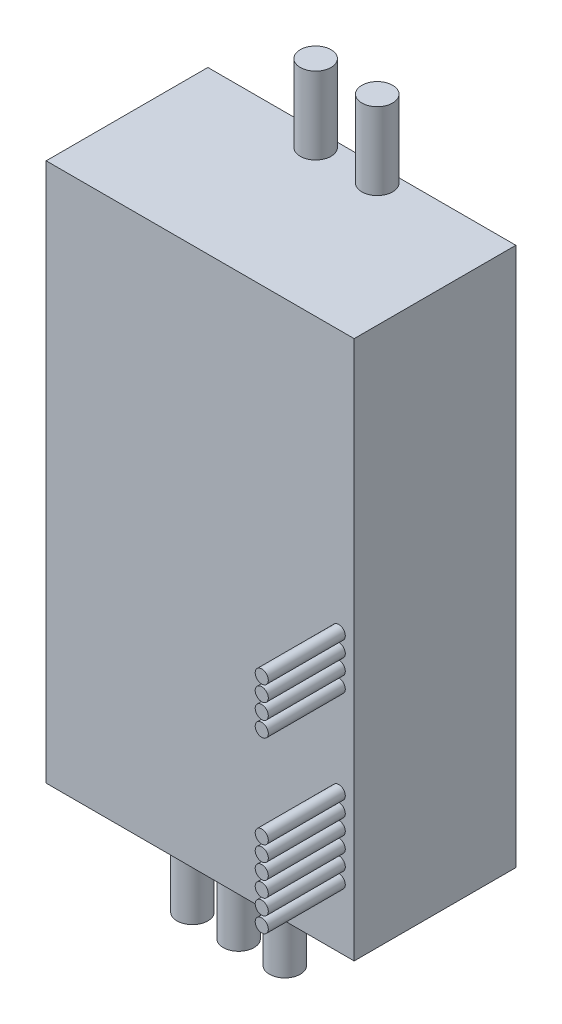
ISO-10303-21;
HEADER;
FILE_DESCRIPTION(('STEP AP214'),'2;1');
FILE_NAME('part.step','',(''),(''),'','','');
FILE_SCHEMA(('AUTOMOTIVE_DESIGN { 1 0 10303 214 1 1 1 1 }'));
ENDSEC;
DATA;
#1=APPLICATION_CONTEXT('core data for automotive mechanical design processes');
#2=APPLICATION_PROTOCOL_DEFINITION('international standard','automotive_design',2000,#1);
#3=PRODUCT_CONTEXT('',#1,'mechanical');
#4=PRODUCT('Part','Part','',(#3));
#5=PRODUCT_RELATED_PRODUCT_CATEGORY('part','',(#4));
#6=PRODUCT_DEFINITION_FORMATION('','',#4);
#7=PRODUCT_DEFINITION_CONTEXT('part definition',#1,'design');
#8=PRODUCT_DEFINITION('design','',#6,#7);
#9=PRODUCT_DEFINITION_SHAPE('','',#8);
#10=(LENGTH_UNIT() NAMED_UNIT(*) SI_UNIT(.MILLI.,.METRE.));
#11=(NAMED_UNIT(*) PLANE_ANGLE_UNIT() SI_UNIT($,.RADIAN.));
#12=(NAMED_UNIT(*) SI_UNIT($,.STERADIAN.) SOLID_ANGLE_UNIT());
#13=UNCERTAINTY_MEASURE_WITH_UNIT(LENGTH_MEASURE(1.E-05),#10,'distance_accuracy_value','');
#14=(GEOMETRIC_REPRESENTATION_CONTEXT(3) GLOBAL_UNCERTAINTY_ASSIGNED_CONTEXT((#13)) GLOBAL_UNIT_ASSIGNED_CONTEXT((#10,
#11,#12)) REPRESENTATION_CONTEXT('',''));
#15=CARTESIAN_POINT('',(0.,0.,0.));
#16=DIRECTION('',(0.,0.,1.));
#17=DIRECTION('',(1.,0.,0.));
#18=AXIS2_PLACEMENT_3D('',#15,#16,#17);
#19=CARTESIAN_POINT('',(-20.,35.,21.));
#20=DIRECTION('',(0.,-1.,0.));
#21=DIRECTION('',(1.,0.,0.));
#22=AXIS2_PLACEMENT_3D('',#19,#20,#21);
#23=PLANE('',#22);
#24=DIRECTION('',(-1.,0.,0.));
#25=VECTOR('',#24,1.);
#26=CARTESIAN_POINT('',(-20.,35.,0.));
#27=LINE('',#26,#25);
#28=CARTESIAN_POINT('',(20.,35.,0.));
#29=VERTEX_POINT('',#28);
#30=CARTESIAN_POINT('',(3.99999999999999,35.,0.));
#31=VERTEX_POINT('',#30);
#32=EDGE_CURVE('E110',#29,#31,#27,.T.);
#33=ORIENTED_EDGE('',*,*,#32,.T.);
#34=CARTESIAN_POINT('',(3.99999999999999,35.,2.));
#35=DIRECTION('',(0.,1.,0.));
#36=DIRECTION('',(-1.,0.,0.));
#37=AXIS2_PLACEMENT_3D('',#34,#35,#36);
#38=CIRCLE('',#37,2.);
#39=EDGE_CURVE('E102',#31,#31,#38,.T.);
#40=ORIENTED_EDGE('',*,*,#39,.F.);
#41=CARTESIAN_POINT('',(-4.00000000000001,35.,0.));
#42=VERTEX_POINT('',#41);
#43=EDGE_CURVE('E97',#31,#42,#27,.T.);
#44=ORIENTED_EDGE('',*,*,#43,.T.);
#45=CARTESIAN_POINT('',(-4.00000000000001,35.,2.));
#46=DIRECTION('',(0.,1.,0.));
#47=DIRECTION('',(-1.,0.,0.));
#48=AXIS2_PLACEMENT_3D('',#45,#46,#47);
#49=CIRCLE('',#48,2.);
#50=EDGE_CURVE('E105',#42,#42,#49,.T.);
#51=ORIENTED_EDGE('',*,*,#50,.F.);
#52=CARTESIAN_POINT('',(-20.,35.,0.));
#53=VERTEX_POINT('',#52);
#54=EDGE_CURVE('E107',#42,#53,#27,.T.);
#55=ORIENTED_EDGE('',*,*,#54,.T.);
#56=DIRECTION('',(0.,0.,-1.));
#57=VECTOR('',#56,1.);
#58=CARTESIAN_POINT('',(-20.,35.,21.));
#59=LINE('',#58,#57);
#60=CARTESIAN_POINT('',(-20.,35.,21.));
#61=VERTEX_POINT('',#60);
#62=EDGE_CURVE('E45',#61,#53,#59,.T.);
#63=ORIENTED_EDGE('',*,*,#62,.F.);
#64=DIRECTION('',(-1.,0.,0.));
#65=VECTOR('',#64,1.);
#66=CARTESIAN_POINT('',(-20.,35.,21.));
#67=LINE('',#66,#65);
#68=CARTESIAN_POINT('',(20.,35.,21.));
#69=VERTEX_POINT('',#68);
#70=EDGE_CURVE('E125',#69,#61,#67,.T.);
#71=ORIENTED_EDGE('',*,*,#70,.F.);
#72=DIRECTION('',(0.,0.,-1.));
#73=VECTOR('',#72,1.);
#74=CARTESIAN_POINT('',(20.,35.,21.));
#75=LINE('',#74,#73);
#76=EDGE_CURVE('E121',#69,#29,#75,.T.);
#77=ORIENTED_EDGE('',*,*,#76,.T.);
#78=EDGE_LOOP('',(#33,#40,#44,#51,#55,#63,#71,#77));
#79=FACE_BOUND('',#78,.T.);
#80=ADVANCED_FACE('F39',(#79),#23,.F.);
#81=CARTESIAN_POINT('',(-20.,-35.,21.));
#82=DIRECTION('',(1.,0.,0.));
#83=DIRECTION('',(0.,0.,-1.));
#84=AXIS2_PLACEMENT_3D('',#81,#82,#83);
#85=PLANE('',#84);
#86=DIRECTION('',(0.,-1.,0.));
#87=VECTOR('',#86,1.);
#88=CARTESIAN_POINT('',(-20.,-35.,0.));
#89=LINE('',#88,#87);
#90=CARTESIAN_POINT('',(-20.,-35.,0.));
#91=VERTEX_POINT('',#90);
#92=EDGE_CURVE('E115',#53,#91,#89,.T.);
#93=ORIENTED_EDGE('',*,*,#92,.T.);
#94=DIRECTION('',(0.,0.,-1.));
#95=VECTOR('',#94,1.);
#96=CARTESIAN_POINT('',(-20.,-35.,21.));
#97=LINE('',#96,#95);
#98=CARTESIAN_POINT('',(-20.,-35.,21.));
#99=VERTEX_POINT('',#98);
#100=EDGE_CURVE('E130',#99,#91,#97,.T.);
#101=ORIENTED_EDGE('',*,*,#100,.F.);
#102=DIRECTION('',(0.,-1.,0.));
#103=VECTOR('',#102,1.);
#104=CARTESIAN_POINT('',(-20.,-35.,21.));
#105=LINE('',#104,#103);
#106=EDGE_CURVE('E90',#61,#99,#105,.T.);
#107=ORIENTED_EDGE('',*,*,#106,.F.);
#108=ORIENTED_EDGE('',*,*,#62,.T.);
#109=EDGE_LOOP('',(#93,#101,#107,#108));
#110=FACE_BOUND('',#109,.T.);
#111=ADVANCED_FACE('F159',(#110),#85,.F.);
#112=CARTESIAN_POINT('',(-20.,-35.,21.));
#113=DIRECTION('',(0.,1.,0.));
#114=DIRECTION('',(-1.,0.,0.));
#115=AXIS2_PLACEMENT_3D('',#112,#113,#114);
#116=PLANE('',#115);
#117=CARTESIAN_POINT('',(-5.99999999999999,-35.,16.));
#118=DIRECTION('',(0.,-1.,0.));
#119=DIRECTION('',(1.,0.,0.));
#120=AXIS2_PLACEMENT_3D('',#117,#118,#119);
#121=CIRCLE('',#120,2.);
#122=CARTESIAN_POINT('',(-3.99999999999999,-35.,16.));
#123=VERTEX_POINT('',#122);
#124=EDGE_CURVE('E137',#123,#123,#121,.T.);
#125=ORIENTED_EDGE('',*,*,#124,.F.);
#126=EDGE_LOOP('',(#125));
#127=FACE_BOUND('',#126,.T.);
#128=CARTESIAN_POINT('',(0.,-35.,16.));
#129=DIRECTION('',(0.,-1.,0.));
#130=DIRECTION('',(1.,0.,0.));
#131=AXIS2_PLACEMENT_3D('',#128,#129,#130);
#132=CIRCLE('',#131,2.);
#133=CARTESIAN_POINT('',(2.00000000000001,-35.,16.));
#134=VERTEX_POINT('',#133);
#135=EDGE_CURVE('E132',#134,#134,#132,.T.);
#136=ORIENTED_EDGE('',*,*,#135,.F.);
#137=EDGE_LOOP('',(#136));
#138=FACE_BOUND('',#137,.T.);
#139=CARTESIAN_POINT('',(6.00000000000001,-35.,16.));
#140=DIRECTION('',(0.,-1.,0.));
#141=DIRECTION('',(1.,0.,0.));
#142=AXIS2_PLACEMENT_3D('',#139,#140,#141);
#143=CIRCLE('',#142,2.);
#144=CARTESIAN_POINT('',(8.00000000000001,-35.,16.));
#145=VERTEX_POINT('',#144);
#146=EDGE_CURVE('E129',#145,#145,#143,.T.);
#147=ORIENTED_EDGE('',*,*,#146,.F.);
#148=EDGE_LOOP('',(#147));
#149=FACE_BOUND('',#148,.T.);
#150=DIRECTION('',(1.,0.,0.));
#151=VECTOR('',#150,1.);
#152=CARTESIAN_POINT('',(-20.,-35.,0.));
#153=LINE('',#152,#151);
#154=CARTESIAN_POINT('',(20.,-35.,0.));
#155=VERTEX_POINT('',#154);
#156=EDGE_CURVE('E73',#91,#155,#153,.T.);
#157=ORIENTED_EDGE('',*,*,#156,.T.);
#158=DIRECTION('',(0.,0.,-1.));
#159=VECTOR('',#158,1.);
#160=CARTESIAN_POINT('',(20.,-35.,21.));
#161=LINE('',#160,#159);
#162=CARTESIAN_POINT('',(20.,-35.,21.));
#163=VERTEX_POINT('',#162);
#164=EDGE_CURVE('E127',#163,#155,#161,.T.);
#165=ORIENTED_EDGE('',*,*,#164,.F.);
#166=DIRECTION('',(1.,0.,0.));
#167=VECTOR('',#166,1.);
#168=CARTESIAN_POINT('',(-20.,-35.,21.));
#169=LINE('',#168,#167);
#170=EDGE_CURVE('E148',#99,#163,#169,.T.);
#171=ORIENTED_EDGE('',*,*,#170,.F.);
#172=ORIENTED_EDGE('',*,*,#100,.T.);
#173=EDGE_LOOP('',(#157,#165,#171,#172));
#174=FACE_BOUND('',#173,.T.);
#175=ADVANCED_FACE('F146',(#127,#138,#149,#174),#116,.F.);
#176=CARTESIAN_POINT('',(20.,-35.,21.));
#177=DIRECTION('',(-1.,0.,0.));
#178=DIRECTION('',(0.,0.,1.));
#179=AXIS2_PLACEMENT_3D('',#176,#177,#178);
#180=PLANE('',#179);
#181=DIRECTION('',(0.,1.,0.));
#182=VECTOR('',#181,1.);
#183=CARTESIAN_POINT('',(20.,-35.,0.));
#184=LINE('',#183,#182);
#185=EDGE_CURVE('E82',#155,#29,#184,.T.);
#186=ORIENTED_EDGE('',*,*,#185,.T.);
#187=ORIENTED_EDGE('',*,*,#76,.F.);
#188=DIRECTION('',(0.,1.,0.));
#189=VECTOR('',#188,1.);
#190=CARTESIAN_POINT('',(20.,-35.,21.));
#191=LINE('',#190,#189);
#192=EDGE_CURVE('E60',#163,#69,#191,.T.);
#193=ORIENTED_EDGE('',*,*,#192,.F.);
#194=ORIENTED_EDGE('',*,*,#164,.T.);
#195=EDGE_LOOP('',(#186,#187,#193,#194));
#196=FACE_BOUND('',#195,.T.);
#197=ADVANCED_FACE('F149',(#196),#180,.F.);
#198=CARTESIAN_POINT('',(0.,0.,21.));
#199=DIRECTION('',(0.,0.,1.));
#200=DIRECTION('',(1.,0.,0.));
#201=AXIS2_PLACEMENT_3D('',#198,#199,#200);
#202=PLANE('',#201);
#203=CARTESIAN_POINT('',(18.,-27.,21.));
#204=DIRECTION('',(0.,0.,1.));
#205=DIRECTION('',(1.,0.,0.));
#206=AXIS2_PLACEMENT_3D('',#203,#204,#205);
#207=CIRCLE('',#206,0.85);
#208=CARTESIAN_POINT('',(18.85,-27.,21.));
#209=VERTEX_POINT('',#208);
#210=EDGE_CURVE('E11',#209,#209,#207,.T.);
#211=ORIENTED_EDGE('',*,*,#210,.F.);
#212=EDGE_LOOP('',(#211));
#213=FACE_BOUND('',#212,.T.);
#214=CARTESIAN_POINT('',(18.,-1.,21.));
#215=DIRECTION('',(0.,0.,1.));
#216=DIRECTION('',(1.,0.,0.));
#217=AXIS2_PLACEMENT_3D('',#214,#215,#216);
#218=CIRCLE('',#217,0.85);
#219=CARTESIAN_POINT('',(18.85,-1.,21.));
#220=VERTEX_POINT('',#219);
#221=EDGE_CURVE('E48',#220,#220,#218,.T.);
#222=ORIENTED_EDGE('',*,*,#221,.F.);
#223=EDGE_LOOP('',(#222));
#224=FACE_BOUND('',#223,.T.);
#225=CARTESIAN_POINT('',(18.,-3.,21.));
#226=DIRECTION('',(0.,0.,1.));
#227=DIRECTION('',(1.,0.,0.));
#228=AXIS2_PLACEMENT_3D('',#225,#226,#227);
#229=CIRCLE('',#228,0.85);
#230=CARTESIAN_POINT('',(18.85,-3.,21.));
#231=VERTEX_POINT('',#230);
#232=EDGE_CURVE('E525',#231,#231,#229,.T.);
#233=ORIENTED_EDGE('',*,*,#232,.F.);
#234=EDGE_LOOP('',(#233));
#235=FACE_BOUND('',#234,.T.);
#236=CARTESIAN_POINT('',(18.,-17.,21.));
#237=DIRECTION('',(0.,0.,1.));
#238=DIRECTION('',(1.,0.,0.));
#239=AXIS2_PLACEMENT_3D('',#236,#237,#238);
#240=CIRCLE('',#239,0.849999999999999);
#241=CARTESIAN_POINT('',(18.85,-17.,21.));
#242=VERTEX_POINT('',#241);
#243=EDGE_CURVE('E514',#242,#242,#240,.T.);
#244=ORIENTED_EDGE('',*,*,#243,.F.);
#245=EDGE_LOOP('',(#244));
#246=FACE_BOUND('',#245,.T.);
#247=CARTESIAN_POINT('',(18.,-19.,21.));
#248=DIRECTION('',(0.,0.,1.));
#249=DIRECTION('',(1.,0.,0.));
#250=AXIS2_PLACEMENT_3D('',#247,#248,#249);
#251=CIRCLE('',#250,0.85);
#252=CARTESIAN_POINT('',(18.85,-19.,21.));
#253=VERTEX_POINT('',#252);
#254=EDGE_CURVE('E512',#253,#253,#251,.T.);
#255=ORIENTED_EDGE('',*,*,#254,.F.);
#256=EDGE_LOOP('',(#255));
#257=FACE_BOUND('',#256,.T.);
#258=CARTESIAN_POINT('',(18.,-5.,21.));
#259=DIRECTION('',(0.,0.,1.));
#260=DIRECTION('',(1.,0.,0.));
#261=AXIS2_PLACEMENT_3D('',#258,#259,#260);
#262=CIRCLE('',#261,0.85);
#263=CARTESIAN_POINT('',(18.85,-5.,21.));
#264=VERTEX_POINT('',#263);
#265=EDGE_CURVE('E513',#264,#264,#262,.T.);
#266=ORIENTED_EDGE('',*,*,#265,.F.);
#267=EDGE_LOOP('',(#266));
#268=FACE_BOUND('',#267,.T.);
#269=CARTESIAN_POINT('',(18.,-25.,21.));
#270=DIRECTION('',(0.,0.,1.));
#271=DIRECTION('',(1.,0.,0.));
#272=AXIS2_PLACEMENT_3D('',#269,#270,#271);
#273=CIRCLE('',#272,0.849999999999999);
#274=CARTESIAN_POINT('',(18.85,-25.,21.));
#275=VERTEX_POINT('',#274);
#276=EDGE_CURVE('E539',#275,#275,#273,.T.);
#277=ORIENTED_EDGE('',*,*,#276,.F.);
#278=EDGE_LOOP('',(#277));
#279=FACE_BOUND('',#278,.T.);
#280=CARTESIAN_POINT('',(18.,-23.,21.));
#281=DIRECTION('',(0.,0.,1.));
#282=DIRECTION('',(1.,0.,0.));
#283=AXIS2_PLACEMENT_3D('',#280,#281,#282);
#284=CIRCLE('',#283,0.85);
#285=CARTESIAN_POINT('',(18.85,-23.,21.));
#286=VERTEX_POINT('',#285);
#287=EDGE_CURVE('E540',#286,#286,#284,.T.);
#288=ORIENTED_EDGE('',*,*,#287,.F.);
#289=EDGE_LOOP('',(#288));
#290=FACE_BOUND('',#289,.T.);
#291=CARTESIAN_POINT('',(18.,-21.,21.));
#292=DIRECTION('',(0.,0.,1.));
#293=DIRECTION('',(1.,0.,0.));
#294=AXIS2_PLACEMENT_3D('',#291,#292,#293);
#295=CIRCLE('',#294,0.850000000000001);
#296=CARTESIAN_POINT('',(18.85,-21.,21.));
#297=VERTEX_POINT('',#296);
#298=EDGE_CURVE('E541',#297,#297,#295,.T.);
#299=ORIENTED_EDGE('',*,*,#298,.F.);
#300=EDGE_LOOP('',(#299));
#301=FACE_BOUND('',#300,.T.);
#302=CARTESIAN_POINT('',(18.,0.999999999999999,21.));
#303=DIRECTION('',(0.,0.,1.));
#304=DIRECTION('',(1.,0.,0.));
#305=AXIS2_PLACEMENT_3D('',#302,#303,#304);
#306=CIRCLE('',#305,0.85);
#307=CARTESIAN_POINT('',(18.85,0.999999999999999,21.));
#308=VERTEX_POINT('',#307);
#309=EDGE_CURVE('E550',#308,#308,#306,.T.);
#310=ORIENTED_EDGE('',*,*,#309,.F.);
#311=EDGE_LOOP('',(#310));
#312=FACE_BOUND('',#311,.T.);
#313=ORIENTED_EDGE('',*,*,#70,.T.);
#314=ORIENTED_EDGE('',*,*,#106,.T.);
#315=ORIENTED_EDGE('',*,*,#170,.T.);
#316=ORIENTED_EDGE('',*,*,#192,.T.);
#317=EDGE_LOOP('',(#313,#314,#315,#316));
#318=FACE_BOUND('',#317,.T.);
#319=ADVANCED_FACE('F150',(#213,#224,#235,#246,#257,#268,#279,#290,#301,#312,#318),#202,.T.);
#320=CARTESIAN_POINT('',(0.,0.,0.));
#321=DIRECTION('',(0.,0.,1.));
#322=DIRECTION('',(1.,0.,0.));
#323=AXIS2_PLACEMENT_3D('',#320,#321,#322);
#324=PLANE('',#323);
#325=ORIENTED_EDGE('',*,*,#32,.F.);
#326=ORIENTED_EDGE('',*,*,#185,.F.);
#327=ORIENTED_EDGE('',*,*,#156,.F.);
#328=ORIENTED_EDGE('',*,*,#92,.F.);
#329=ORIENTED_EDGE('',*,*,#54,.F.);
#330=ORIENTED_EDGE('',*,*,#43,.F.);
#331=EDGE_LOOP('',(#325,#326,#327,#328,#329,#330));
#332=FACE_BOUND('',#331,.T.);
#333=ADVANCED_FACE('F112',(#332),#324,.F.);
#334=CARTESIAN_POINT('',(6.00000000000001,-45.,16.));
#335=DIRECTION('',(0.,1.,0.));
#336=DIRECTION('',(-1.,0.,0.));
#337=AXIS2_PLACEMENT_3D('',#334,#335,#336);
#338=CYLINDRICAL_SURFACE('',#337,2.);
#339=CARTESIAN_POINT('',(6.00000000000001,-45.,16.));
#340=DIRECTION('',(0.,-1.,0.));
#341=DIRECTION('',(1.,0.,0.));
#342=AXIS2_PLACEMENT_3D('',#339,#340,#341);
#343=CIRCLE('',#342,2.);
#344=CARTESIAN_POINT('',(8.00000000000001,-45.,16.));
#345=VERTEX_POINT('',#344);
#346=EDGE_CURVE('E138',#345,#345,#343,.T.);
#347=ORIENTED_EDGE('',*,*,#346,.F.);
#348=EDGE_LOOP('',(#347));
#349=FACE_BOUND('',#348,.T.);
#350=ORIENTED_EDGE('',*,*,#146,.T.);
#351=EDGE_LOOP('',(#350));
#352=FACE_BOUND('',#351,.T.);
#353=ADVANCED_FACE('F205',(#349,#352),#338,.T.);
#354=CARTESIAN_POINT('',(6.00000000000001,-45.,16.));
#355=DIRECTION('',(0.,-1.,0.));
#356=DIRECTION('',(1.,0.,0.));
#357=AXIS2_PLACEMENT_3D('',#354,#355,#356);
#358=PLANE('',#357);
#359=ORIENTED_EDGE('',*,*,#346,.T.);
#360=EDGE_LOOP('',(#359));
#361=FACE_BOUND('',#360,.T.);
#362=ADVANCED_FACE('F209',(#361),#358,.T.);
#363=CARTESIAN_POINT('',(0.,-45.,16.));
#364=DIRECTION('',(0.,1.,0.));
#365=DIRECTION('',(-1.,0.,0.));
#366=AXIS2_PLACEMENT_3D('',#363,#364,#365);
#367=CYLINDRICAL_SURFACE('',#366,2.);
#368=CARTESIAN_POINT('',(0.,-45.,16.));
#369=DIRECTION('',(0.,-1.,0.));
#370=DIRECTION('',(1.,0.,0.));
#371=AXIS2_PLACEMENT_3D('',#368,#369,#370);
#372=CIRCLE('',#371,2.);
#373=CARTESIAN_POINT('',(2.00000000000001,-45.,16.));
#374=VERTEX_POINT('',#373);
#375=EDGE_CURVE('E117',#374,#374,#372,.T.);
#376=ORIENTED_EDGE('',*,*,#375,.F.);
#377=EDGE_LOOP('',(#376));
#378=FACE_BOUND('',#377,.T.);
#379=ORIENTED_EDGE('',*,*,#135,.T.);
#380=EDGE_LOOP('',(#379));
#381=FACE_BOUND('',#380,.T.);
#382=ADVANCED_FACE('F219',(#378,#381),#367,.T.);
#383=CARTESIAN_POINT('',(0.,-45.,16.));
#384=DIRECTION('',(0.,-1.,0.));
#385=DIRECTION('',(1.,0.,0.));
#386=AXIS2_PLACEMENT_3D('',#383,#384,#385);
#387=PLANE('',#386);
#388=ORIENTED_EDGE('',*,*,#375,.T.);
#389=EDGE_LOOP('',(#388));
#390=FACE_BOUND('',#389,.T.);
#391=ADVANCED_FACE('F228',(#390),#387,.T.);
#392=CARTESIAN_POINT('',(-5.99999999999999,-45.,16.));
#393=DIRECTION('',(0.,1.,0.));
#394=DIRECTION('',(-1.,0.,0.));
#395=AXIS2_PLACEMENT_3D('',#392,#393,#394);
#396=CYLINDRICAL_SURFACE('',#395,2.);
#397=CARTESIAN_POINT('',(-5.99999999999999,-45.,16.));
#398=DIRECTION('',(0.,-1.,0.));
#399=DIRECTION('',(1.,0.,0.));
#400=AXIS2_PLACEMENT_3D('',#397,#398,#399);
#401=CIRCLE('',#400,2.);
#402=CARTESIAN_POINT('',(-3.99999999999999,-45.,16.));
#403=VERTEX_POINT('',#402);
#404=EDGE_CURVE('E111',#403,#403,#401,.T.);
#405=ORIENTED_EDGE('',*,*,#404,.F.);
#406=EDGE_LOOP('',(#405));
#407=FACE_BOUND('',#406,.T.);
#408=ORIENTED_EDGE('',*,*,#124,.T.);
#409=EDGE_LOOP('',(#408));
#410=FACE_BOUND('',#409,.T.);
#411=ADVANCED_FACE('F238',(#407,#410),#396,.T.);
#412=CARTESIAN_POINT('',(-5.99999999999999,-45.,16.));
#413=DIRECTION('',(0.,-1.,0.));
#414=DIRECTION('',(1.,0.,0.));
#415=AXIS2_PLACEMENT_3D('',#412,#413,#414);
#416=PLANE('',#415);
#417=ORIENTED_EDGE('',*,*,#404,.T.);
#418=EDGE_LOOP('',(#417));
#419=FACE_BOUND('',#418,.T.);
#420=ADVANCED_FACE('F248',(#419),#416,.T.);
#421=CARTESIAN_POINT('',(-4.00000000000002,45.,2.));
#422=DIRECTION('',(0.,-1.,0.));
#423=DIRECTION('',(1.,0.,0.));
#424=AXIS2_PLACEMENT_3D('',#421,#422,#423);
#425=CYLINDRICAL_SURFACE('',#424,2.);
#426=CARTESIAN_POINT('',(-4.00000000000002,45.,2.));
#427=DIRECTION('',(0.,1.,0.));
#428=DIRECTION('',(-1.,0.,0.));
#429=AXIS2_PLACEMENT_3D('',#426,#427,#428);
#430=CIRCLE('',#429,2.);
#431=CARTESIAN_POINT('',(-6.00000000000002,45.,2.));
#432=VERTEX_POINT('',#431);
#433=EDGE_CURVE('E505',#432,#432,#430,.T.);
#434=ORIENTED_EDGE('',*,*,#433,.F.);
#435=EDGE_LOOP('',(#434));
#436=FACE_BOUND('',#435,.T.);
#437=ORIENTED_EDGE('',*,*,#50,.T.);
#438=EDGE_LOOP('',(#437));
#439=FACE_BOUND('',#438,.T.);
#440=ADVANCED_FACE('F259',(#436,#439),#425,.T.);
#441=CARTESIAN_POINT('',(-4.00000000000002,45.,2.));
#442=DIRECTION('',(0.,1.,0.));
#443=DIRECTION('',(-1.,0.,0.));
#444=AXIS2_PLACEMENT_3D('',#441,#442,#443);
#445=PLANE('',#444);
#446=ORIENTED_EDGE('',*,*,#433,.T.);
#447=EDGE_LOOP('',(#446));
#448=FACE_BOUND('',#447,.T.);
#449=ADVANCED_FACE('F268',(#448),#445,.T.);
#450=CARTESIAN_POINT('',(3.99999999999998,45.,2.));
#451=DIRECTION('',(0.,-1.,0.));
#452=DIRECTION('',(1.,0.,0.));
#453=AXIS2_PLACEMENT_3D('',#450,#451,#452);
#454=CYLINDRICAL_SURFACE('',#453,2.);
#455=CARTESIAN_POINT('',(3.99999999999998,45.,2.));
#456=DIRECTION('',(0.,1.,0.));
#457=DIRECTION('',(-1.,0.,0.));
#458=AXIS2_PLACEMENT_3D('',#455,#456,#457);
#459=CIRCLE('',#458,2.);
#460=CARTESIAN_POINT('',(1.99999999999998,45.,2.));
#461=VERTEX_POINT('',#460);
#462=EDGE_CURVE('E141',#461,#461,#459,.T.);
#463=ORIENTED_EDGE('',*,*,#462,.F.);
#464=EDGE_LOOP('',(#463));
#465=FACE_BOUND('',#464,.T.);
#466=ORIENTED_EDGE('',*,*,#39,.T.);
#467=EDGE_LOOP('',(#466));
#468=FACE_BOUND('',#467,.T.);
#469=ADVANCED_FACE('F279',(#465,#468),#454,.T.);
#470=CARTESIAN_POINT('',(3.99999999999998,45.,2.));
#471=DIRECTION('',(0.,1.,0.));
#472=DIRECTION('',(-1.,0.,0.));
#473=AXIS2_PLACEMENT_3D('',#470,#471,#472);
#474=PLANE('',#473);
#475=ORIENTED_EDGE('',*,*,#462,.T.);
#476=EDGE_LOOP('',(#475));
#477=FACE_BOUND('',#476,.T.);
#478=ADVANCED_FACE('F290',(#477),#474,.T.);
#479=CARTESIAN_POINT('',(18.,0.999999999999999,31.));
#480=DIRECTION('',(0.,0.,-1.));
#481=DIRECTION('',(-1.,0.,0.));
#482=AXIS2_PLACEMENT_3D('',#479,#480,#481);
#483=CYLINDRICAL_SURFACE('',#482,0.85);
#484=CARTESIAN_POINT('',(18.,0.999999999999999,31.));
#485=DIRECTION('',(0.,0.,1.));
#486=DIRECTION('',(1.,0.,0.));
#487=AXIS2_PLACEMENT_3D('',#484,#485,#486);
#488=CIRCLE('',#487,0.85);
#489=CARTESIAN_POINT('',(18.85,0.999999999999999,31.));
#490=VERTEX_POINT('',#489);
#491=EDGE_CURVE('E536',#490,#490,#488,.T.);
#492=ORIENTED_EDGE('',*,*,#491,.F.);
#493=EDGE_LOOP('',(#492));
#494=FACE_BOUND('',#493,.T.);
#495=ORIENTED_EDGE('',*,*,#309,.T.);
#496=EDGE_LOOP('',(#495));
#497=FACE_BOUND('',#496,.T.);
#498=ADVANCED_FACE('F300',(#494,#497),#483,.T.);
#499=CARTESIAN_POINT('',(18.,0.999999999999999,31.));
#500=DIRECTION('',(0.,0.,1.));
#501=DIRECTION('',(1.,0.,0.));
#502=AXIS2_PLACEMENT_3D('',#499,#500,#501);
#503=PLANE('',#502);
#504=ORIENTED_EDGE('',*,*,#491,.T.);
#505=EDGE_LOOP('',(#504));
#506=FACE_BOUND('',#505,.T.);
#507=ADVANCED_FACE('F308',(#506),#503,.T.);
#508=CARTESIAN_POINT('',(18.,-21.,31.));
#509=DIRECTION('',(0.,0.,-1.));
#510=DIRECTION('',(-1.,0.,0.));
#511=AXIS2_PLACEMENT_3D('',#508,#509,#510);
#512=CYLINDRICAL_SURFACE('',#511,0.850000000000001);
#513=CARTESIAN_POINT('',(18.,-21.,31.));
#514=DIRECTION('',(0.,0.,1.));
#515=DIRECTION('',(1.,0.,0.));
#516=AXIS2_PLACEMENT_3D('',#513,#514,#515);
#517=CIRCLE('',#516,0.850000000000001);
#518=CARTESIAN_POINT('',(18.85,-21.,31.));
#519=VERTEX_POINT('',#518);
#520=EDGE_CURVE('E516',#519,#519,#517,.T.);
#521=ORIENTED_EDGE('',*,*,#520,.F.);
#522=EDGE_LOOP('',(#521));
#523=FACE_BOUND('',#522,.T.);
#524=ORIENTED_EDGE('',*,*,#298,.T.);
#525=EDGE_LOOP('',(#524));
#526=FACE_BOUND('',#525,.T.);
#527=ADVANCED_FACE('F316',(#523,#526),#512,.T.);
#528=CARTESIAN_POINT('',(18.,-21.,31.));
#529=DIRECTION('',(0.,0.,1.));
#530=DIRECTION('',(1.,0.,0.));
#531=AXIS2_PLACEMENT_3D('',#528,#529,#530);
#532=PLANE('',#531);
#533=ORIENTED_EDGE('',*,*,#520,.T.);
#534=EDGE_LOOP('',(#533));
#535=FACE_BOUND('',#534,.T.);
#536=ADVANCED_FACE('F326',(#535),#532,.T.);
#537=CARTESIAN_POINT('',(18.,-23.,31.));
#538=DIRECTION('',(0.,0.,-1.));
#539=DIRECTION('',(-1.,0.,0.));
#540=AXIS2_PLACEMENT_3D('',#537,#538,#539);
#541=CYLINDRICAL_SURFACE('',#540,0.85);
#542=CARTESIAN_POINT('',(18.,-23.,31.));
#543=DIRECTION('',(0.,0.,1.));
#544=DIRECTION('',(1.,0.,0.));
#545=AXIS2_PLACEMENT_3D('',#542,#543,#544);
#546=CIRCLE('',#545,0.85);
#547=CARTESIAN_POINT('',(18.85,-23.,31.));
#548=VERTEX_POINT('',#547);
#549=EDGE_CURVE('E545',#548,#548,#546,.T.);
#550=ORIENTED_EDGE('',*,*,#549,.F.);
#551=EDGE_LOOP('',(#550));
#552=FACE_BOUND('',#551,.T.);
#553=ORIENTED_EDGE('',*,*,#287,.T.);
#554=EDGE_LOOP('',(#553));
#555=FACE_BOUND('',#554,.T.);
#556=ADVANCED_FACE('F337',(#552,#555),#541,.T.);
#557=CARTESIAN_POINT('',(18.,-23.,31.));
#558=DIRECTION('',(0.,0.,1.));
#559=DIRECTION('',(1.,0.,0.));
#560=AXIS2_PLACEMENT_3D('',#557,#558,#559);
#561=PLANE('',#560);
#562=ORIENTED_EDGE('',*,*,#549,.T.);
#563=EDGE_LOOP('',(#562));
#564=FACE_BOUND('',#563,.T.);
#565=ADVANCED_FACE('F347',(#564),#561,.T.);
#566=CARTESIAN_POINT('',(18.,-25.,31.));
#567=DIRECTION('',(0.,0.,-1.));
#568=DIRECTION('',(-1.,0.,0.));
#569=AXIS2_PLACEMENT_3D('',#566,#567,#568);
#570=CYLINDRICAL_SURFACE('',#569,0.849999999999999);
#571=CARTESIAN_POINT('',(18.,-25.,31.));
#572=DIRECTION('',(0.,0.,1.));
#573=DIRECTION('',(1.,0.,0.));
#574=AXIS2_PLACEMENT_3D('',#571,#572,#573);
#575=CIRCLE('',#574,0.849999999999999);
#576=CARTESIAN_POINT('',(18.85,-25.,31.));
#577=VERTEX_POINT('',#576);
#578=EDGE_CURVE('E510',#577,#577,#575,.T.);
#579=ORIENTED_EDGE('',*,*,#578,.F.);
#580=EDGE_LOOP('',(#579));
#581=FACE_BOUND('',#580,.T.);
#582=ORIENTED_EDGE('',*,*,#276,.T.);
#583=EDGE_LOOP('',(#582));
#584=FACE_BOUND('',#583,.T.);
#585=ADVANCED_FACE('F357',(#581,#584),#570,.T.);
#586=CARTESIAN_POINT('',(18.,-25.,31.));
#587=DIRECTION('',(0.,0.,1.));
#588=DIRECTION('',(1.,0.,0.));
#589=AXIS2_PLACEMENT_3D('',#586,#587,#588);
#590=PLANE('',#589);
#591=ORIENTED_EDGE('',*,*,#578,.T.);
#592=EDGE_LOOP('',(#591));
#593=FACE_BOUND('',#592,.T.);
#594=ADVANCED_FACE('F368',(#593),#590,.T.);
#595=CARTESIAN_POINT('',(18.,-5.,31.));
#596=DIRECTION('',(0.,0.,-1.));
#597=DIRECTION('',(-1.,0.,0.));
#598=AXIS2_PLACEMENT_3D('',#595,#596,#597);
#599=CYLINDRICAL_SURFACE('',#598,0.85);
#600=CARTESIAN_POINT('',(18.,-5.,31.));
#601=DIRECTION('',(0.,0.,1.));
#602=DIRECTION('',(1.,0.,0.));
#603=AXIS2_PLACEMENT_3D('',#600,#601,#602);
#604=CIRCLE('',#603,0.85);
#605=CARTESIAN_POINT('',(18.85,-5.,31.));
#606=VERTEX_POINT('',#605);
#607=EDGE_CURVE('E504',#606,#606,#604,.T.);
#608=ORIENTED_EDGE('',*,*,#607,.F.);
#609=EDGE_LOOP('',(#608));
#610=FACE_BOUND('',#609,.T.);
#611=ORIENTED_EDGE('',*,*,#265,.T.);
#612=EDGE_LOOP('',(#611));
#613=FACE_BOUND('',#612,.T.);
#614=ADVANCED_FACE('F376',(#610,#613),#599,.T.);
#615=CARTESIAN_POINT('',(18.,-5.,31.));
#616=DIRECTION('',(0.,0.,1.));
#617=DIRECTION('',(1.,0.,0.));
#618=AXIS2_PLACEMENT_3D('',#615,#616,#617);
#619=PLANE('',#618);
#620=ORIENTED_EDGE('',*,*,#607,.T.);
#621=EDGE_LOOP('',(#620));
#622=FACE_BOUND('',#621,.T.);
#623=ADVANCED_FACE('F387',(#622),#619,.T.);
#624=CARTESIAN_POINT('',(18.,-19.,31.));
#625=DIRECTION('',(0.,0.,-1.));
#626=DIRECTION('',(-1.,0.,0.));
#627=AXIS2_PLACEMENT_3D('',#624,#625,#626);
#628=CYLINDRICAL_SURFACE('',#627,0.85);
#629=CARTESIAN_POINT('',(18.,-19.,31.));
#630=DIRECTION('',(0.,0.,1.));
#631=DIRECTION('',(1.,0.,0.));
#632=AXIS2_PLACEMENT_3D('',#629,#630,#631);
#633=CIRCLE('',#632,0.85);
#634=CARTESIAN_POINT('',(18.85,-19.,31.));
#635=VERTEX_POINT('',#634);
#636=EDGE_CURVE('E517',#635,#635,#633,.T.);
#637=ORIENTED_EDGE('',*,*,#636,.F.);
#638=EDGE_LOOP('',(#637));
#639=FACE_BOUND('',#638,.T.);
#640=ORIENTED_EDGE('',*,*,#254,.T.);
#641=EDGE_LOOP('',(#640));
#642=FACE_BOUND('',#641,.T.);
#643=ADVANCED_FACE('F397',(#639,#642),#628,.T.);
#644=CARTESIAN_POINT('',(18.,-19.,31.));
#645=DIRECTION('',(0.,0.,1.));
#646=DIRECTION('',(1.,0.,0.));
#647=AXIS2_PLACEMENT_3D('',#644,#645,#646);
#648=PLANE('',#647);
#649=ORIENTED_EDGE('',*,*,#636,.T.);
#650=EDGE_LOOP('',(#649));
#651=FACE_BOUND('',#650,.T.);
#652=ADVANCED_FACE('F407',(#651),#648,.T.);
#653=CARTESIAN_POINT('',(18.,-17.,31.));
#654=DIRECTION('',(0.,0.,-1.));
#655=DIRECTION('',(-1.,0.,0.));
#656=AXIS2_PLACEMENT_3D('',#653,#654,#655);
#657=CYLINDRICAL_SURFACE('',#656,0.849999999999999);
#658=CARTESIAN_POINT('',(18.,-17.,31.));
#659=DIRECTION('',(0.,0.,1.));
#660=DIRECTION('',(1.,0.,0.));
#661=AXIS2_PLACEMENT_3D('',#658,#659,#660);
#662=CIRCLE('',#661,0.849999999999999);
#663=CARTESIAN_POINT('',(18.85,-17.,31.));
#664=VERTEX_POINT('',#663);
#665=EDGE_CURVE('E518',#664,#664,#662,.T.);
#666=ORIENTED_EDGE('',*,*,#665,.F.);
#667=EDGE_LOOP('',(#666));
#668=FACE_BOUND('',#667,.T.);
#669=ORIENTED_EDGE('',*,*,#243,.T.);
#670=EDGE_LOOP('',(#669));
#671=FACE_BOUND('',#670,.T.);
#672=ADVANCED_FACE('F418',(#668,#671),#657,.T.);
#673=CARTESIAN_POINT('',(18.,-17.,31.));
#674=DIRECTION('',(0.,0.,1.));
#675=DIRECTION('',(1.,0.,0.));
#676=AXIS2_PLACEMENT_3D('',#673,#674,#675);
#677=PLANE('',#676);
#678=ORIENTED_EDGE('',*,*,#665,.T.);
#679=EDGE_LOOP('',(#678));
#680=FACE_BOUND('',#679,.T.);
#681=ADVANCED_FACE('F426',(#680),#677,.T.);
#682=CARTESIAN_POINT('',(18.,-3.,31.));
#683=DIRECTION('',(0.,0.,-1.));
#684=DIRECTION('',(-1.,0.,0.));
#685=AXIS2_PLACEMENT_3D('',#682,#683,#684);
#686=CYLINDRICAL_SURFACE('',#685,0.85);
#687=CARTESIAN_POINT('',(18.,-3.,31.));
#688=DIRECTION('',(0.,0.,1.));
#689=DIRECTION('',(1.,0.,0.));
#690=AXIS2_PLACEMENT_3D('',#687,#688,#689);
#691=CIRCLE('',#690,0.85);
#692=CARTESIAN_POINT('',(18.85,-3.,31.));
#693=VERTEX_POINT('',#692);
#694=EDGE_CURVE('E528',#693,#693,#691,.T.);
#695=ORIENTED_EDGE('',*,*,#694,.F.);
#696=EDGE_LOOP('',(#695));
#697=FACE_BOUND('',#696,.T.);
#698=ORIENTED_EDGE('',*,*,#232,.T.);
#699=EDGE_LOOP('',(#698));
#700=FACE_BOUND('',#699,.T.);
#701=ADVANCED_FACE('F436',(#697,#700),#686,.T.);
#702=CARTESIAN_POINT('',(18.,-3.,31.));
#703=DIRECTION('',(0.,0.,1.));
#704=DIRECTION('',(1.,0.,0.));
#705=AXIS2_PLACEMENT_3D('',#702,#703,#704);
#706=PLANE('',#705);
#707=ORIENTED_EDGE('',*,*,#694,.T.);
#708=EDGE_LOOP('',(#707));
#709=FACE_BOUND('',#708,.T.);
#710=ADVANCED_FACE('F447',(#709),#706,.T.);
#711=CARTESIAN_POINT('',(18.,-1.,31.));
#712=DIRECTION('',(0.,0.,-1.));
#713=DIRECTION('',(-1.,0.,0.));
#714=AXIS2_PLACEMENT_3D('',#711,#712,#713);
#715=CYLINDRICAL_SURFACE('',#714,0.85);
#716=CARTESIAN_POINT('',(18.,-1.,31.));
#717=DIRECTION('',(0.,0.,1.));
#718=DIRECTION('',(1.,0.,0.));
#719=AXIS2_PLACEMENT_3D('',#716,#717,#718);
#720=CIRCLE('',#719,0.85);
#721=CARTESIAN_POINT('',(18.85,-1.,31.));
#722=VERTEX_POINT('',#721);
#723=EDGE_CURVE('E533',#722,#722,#720,.T.);
#724=ORIENTED_EDGE('',*,*,#723,.F.);
#725=EDGE_LOOP('',(#724));
#726=FACE_BOUND('',#725,.T.);
#727=ORIENTED_EDGE('',*,*,#221,.T.);
#728=EDGE_LOOP('',(#727));
#729=FACE_BOUND('',#728,.T.);
#730=ADVANCED_FACE('F457',(#726,#729),#715,.T.);
#731=CARTESIAN_POINT('',(18.,-1.,31.));
#732=DIRECTION('',(0.,0.,1.));
#733=DIRECTION('',(1.,0.,0.));
#734=AXIS2_PLACEMENT_3D('',#731,#732,#733);
#735=PLANE('',#734);
#736=ORIENTED_EDGE('',*,*,#723,.T.);
#737=EDGE_LOOP('',(#736));
#738=FACE_BOUND('',#737,.T.);
#739=ADVANCED_FACE('F467',(#738),#735,.T.);
#740=CARTESIAN_POINT('',(18.,-27.,31.));
#741=DIRECTION('',(0.,0.,-1.));
#742=DIRECTION('',(-1.,0.,0.));
#743=AXIS2_PLACEMENT_3D('',#740,#741,#742);
#744=CYLINDRICAL_SURFACE('',#743,0.85);
#745=CARTESIAN_POINT('',(18.,-27.,31.));
#746=DIRECTION('',(0.,0.,1.));
#747=DIRECTION('',(1.,0.,0.));
#748=AXIS2_PLACEMENT_3D('',#745,#746,#747);
#749=CIRCLE('',#748,0.85);
#750=CARTESIAN_POINT('',(18.85,-27.,31.));
#751=VERTEX_POINT('',#750);
#752=EDGE_CURVE('E502',#751,#751,#749,.T.);
#753=ORIENTED_EDGE('',*,*,#752,.F.);
#754=EDGE_LOOP('',(#753));
#755=FACE_BOUND('',#754,.T.);
#756=ORIENTED_EDGE('',*,*,#210,.T.);
#757=EDGE_LOOP('',(#756));
#758=FACE_BOUND('',#757,.T.);
#759=ADVANCED_FACE('F478',(#755,#758),#744,.T.);
#760=CARTESIAN_POINT('',(18.,-27.,31.));
#761=DIRECTION('',(0.,0.,1.));
#762=DIRECTION('',(1.,0.,0.));
#763=AXIS2_PLACEMENT_3D('',#760,#761,#762);
#764=PLANE('',#763);
#765=ORIENTED_EDGE('',*,*,#752,.T.);
#766=EDGE_LOOP('',(#765));
#767=FACE_BOUND('',#766,.T.);
#768=ADVANCED_FACE('F486',(#767),#764,.T.);
#769=CLOSED_SHELL('',(#80,#111,#175,#197,#319,#333,#353,#362,#382,#391,#411,#420,#440,#449,#469,
#478,#498,#507,#527,#536,#556,#565,#585,#594,#614,#623,#643,#652,#672,#681,#701,#710,#730,#739,
#759,#768));
#770=MANIFOLD_SOLID_BREP('B2',#769);
#771=ADVANCED_BREP_SHAPE_REPRESENTATION('',(#18,#770),#14);
#772=SHAPE_DEFINITION_REPRESENTATION(#9,#771);
ENDSEC;
END-ISO-10303-21;
